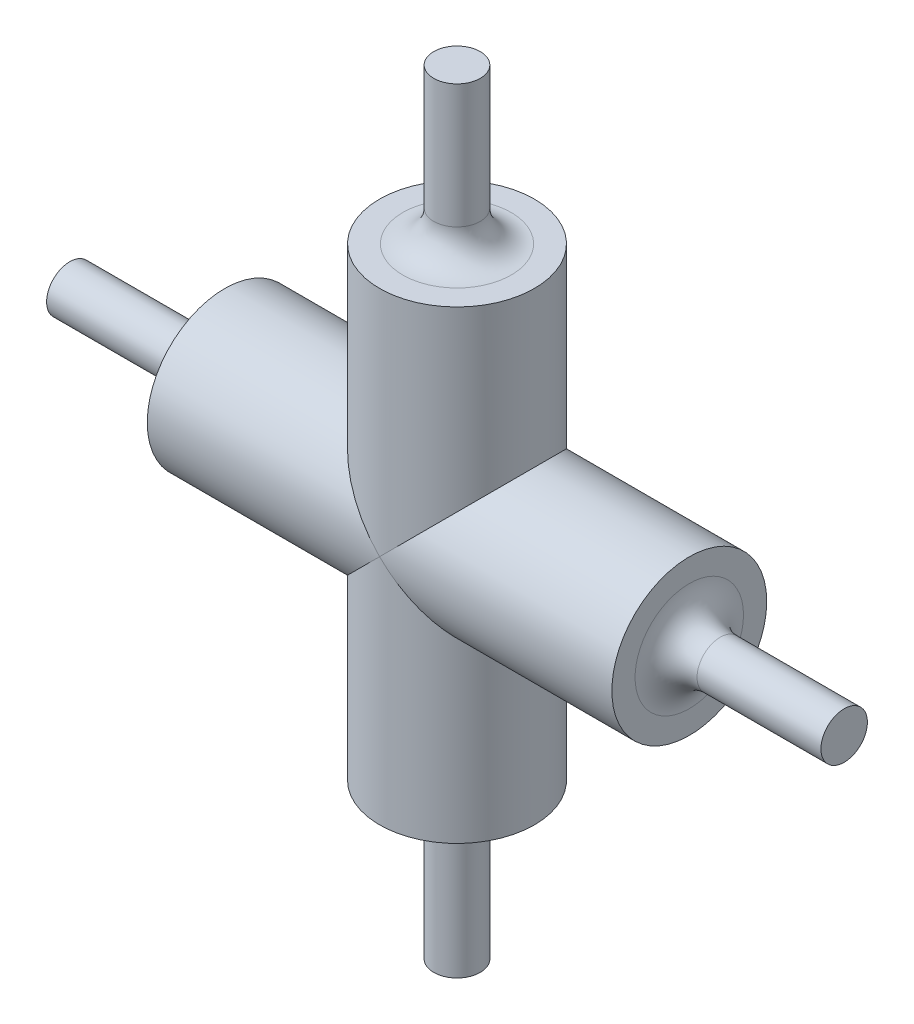
ISO-10303-21;
HEADER;
FILE_DESCRIPTION(('STEP AP214'),'2;1');
FILE_NAME('part.step','',(''),(''),'','','');
FILE_SCHEMA(('AUTOMOTIVE_DESIGN { 1 0 10303 214 1 1 1 1 }'));
ENDSEC;
DATA;
#1=APPLICATION_CONTEXT('core data for automotive mechanical design processes');
#2=APPLICATION_PROTOCOL_DEFINITION('international standard','automotive_design',2000,#1);
#3=PRODUCT_CONTEXT('',#1,'mechanical');
#4=PRODUCT('Part','Part','',(#3));
#5=PRODUCT_RELATED_PRODUCT_CATEGORY('part','',(#4));
#6=PRODUCT_DEFINITION_FORMATION('','',#4);
#7=PRODUCT_DEFINITION_CONTEXT('part definition',#1,'design');
#8=PRODUCT_DEFINITION('design','',#6,#7);
#9=PRODUCT_DEFINITION_SHAPE('','',#8);
#10=(LENGTH_UNIT() NAMED_UNIT(*) SI_UNIT(.MILLI.,.METRE.));
#11=(NAMED_UNIT(*) PLANE_ANGLE_UNIT() SI_UNIT($,.RADIAN.));
#12=(NAMED_UNIT(*) SI_UNIT($,.STERADIAN.) SOLID_ANGLE_UNIT());
#13=UNCERTAINTY_MEASURE_WITH_UNIT(LENGTH_MEASURE(1.E-05),#10,'distance_accuracy_value','');
#14=(GEOMETRIC_REPRESENTATION_CONTEXT(3) GLOBAL_UNCERTAINTY_ASSIGNED_CONTEXT((#13)) GLOBAL_UNIT_ASSIGNED_CONTEXT((#10,
#11,#12)) REPRESENTATION_CONTEXT('',''));
#15=CARTESIAN_POINT('',(0.,0.,0.));
#16=DIRECTION('',(0.,0.,1.));
#17=DIRECTION('',(1.,0.,0.));
#18=AXIS2_PLACEMENT_3D('',#15,#16,#17);
#19=CARTESIAN_POINT('',(0.,50.,0.));
#20=DIRECTION('',(0.,-1.,0.));
#21=DIRECTION('',(0.,0.,-1.));
#22=AXIS2_PLACEMENT_3D('',#19,#20,#21);
#23=CYLINDRICAL_SURFACE('',#22,10.);
#24=CARTESIAN_POINT('',(0.,0.,0.));
#25=DIRECTION('',(-0.707106781186547,-0.707106781186547,0.));
#26=DIRECTION('',(0.707106781186547,-0.707106781186547,0.));
#27=AXIS2_PLACEMENT_3D('',#24,#25,#26);
#28=ELLIPSE('',#27,14.1421356237309,10.);
#29=CARTESIAN_POINT('',(0.,0.,10.));
#30=VERTEX_POINT('',#29);
#31=CARTESIAN_POINT('',(0.,0.,-10.));
#32=VERTEX_POINT('',#31);
#33=EDGE_CURVE('E72',#30,#32,#28,.T.);
#34=ORIENTED_EDGE('',*,*,#33,.F.);
#35=CARTESIAN_POINT('',(0.,0.,0.));
#36=DIRECTION('',(0.707106781186547,-0.707106781186547,0.));
#37=DIRECTION('',(-0.707106781186547,-0.707106781186547,0.));
#38=AXIS2_PLACEMENT_3D('',#35,#36,#37);
#39=ELLIPSE('',#38,14.1421356237309,10.);
#40=EDGE_CURVE('E70',#32,#30,#39,.T.);
#41=ORIENTED_EDGE('',*,*,#40,.F.);
#42=EDGE_LOOP('',(#34,#41));
#43=FACE_BOUND('',#42,.T.);
#44=CARTESIAN_POINT('',(0.,30.,0.));
#45=DIRECTION('',(0.,1.,0.));
#46=DIRECTION('',(-1.,0.,0.));
#47=AXIS2_PLACEMENT_3D('',#44,#45,#46);
#48=CIRCLE('',#47,10.);
#49=CARTESIAN_POINT('',(-10.,30.,0.));
#50=VERTEX_POINT('',#49);
#51=EDGE_CURVE('E115',#50,#50,#48,.T.);
#52=ORIENTED_EDGE('',*,*,#51,.F.);
#53=EDGE_LOOP('',(#52));
#54=FACE_BOUND('',#53,.T.);
#55=ADVANCED_FACE('F49',(#43,#54),#23,.T.);
#56=CARTESIAN_POINT('',(0.,0.,0.));
#57=DIRECTION('',(-0.707106781186547,-0.707106781186547,0.));
#58=DIRECTION('',(0.707106781186547,-0.707106781186547,0.));
#59=AXIS2_PLACEMENT_3D('',#56,#57,#58);
#60=ELLIPSE('',#59,14.1421356237309,10.);
#61=EDGE_CURVE('E80',#30,#32,#60,.F.);
#62=ORIENTED_EDGE('',*,*,#61,.F.);
#63=CARTESIAN_POINT('',(0.,0.,0.));
#64=DIRECTION('',(0.707106781186547,-0.707106781186547,0.));
#65=DIRECTION('',(-0.707106781186547,-0.707106781186547,0.));
#66=AXIS2_PLACEMENT_3D('',#63,#64,#65);
#67=ELLIPSE('',#66,14.1421356237309,10.);
#68=EDGE_CURVE('E64',#32,#30,#67,.F.);
#69=ORIENTED_EDGE('',*,*,#68,.F.);
#70=EDGE_LOOP('',(#62,#69));
#71=FACE_BOUND('',#70,.T.);
#72=CARTESIAN_POINT('',(0.,-30.,0.));
#73=DIRECTION('',(0.,-1.,0.));
#74=DIRECTION('',(1.,0.,0.));
#75=AXIS2_PLACEMENT_3D('',#72,#73,#74);
#76=CIRCLE('',#75,10.);
#77=CARTESIAN_POINT('',(10.,-30.0000000000001,0.));
#78=VERTEX_POINT('',#77);
#79=EDGE_CURVE('E110',#78,#78,#76,.T.);
#80=ORIENTED_EDGE('',*,*,#79,.F.);
#81=EDGE_LOOP('',(#80));
#82=FACE_BOUND('',#81,.T.);
#83=ADVANCED_FACE('F78',(#71,#82),#23,.T.);
#84=CARTESIAN_POINT('',(50.,0.,0.));
#85=DIRECTION('',(-1.,0.,0.));
#86=DIRECTION('',(0.,0.,1.));
#87=AXIS2_PLACEMENT_3D('',#84,#85,#86);
#88=CYLINDRICAL_SURFACE('',#87,10.);
#89=ORIENTED_EDGE('',*,*,#40,.T.);
#90=ORIENTED_EDGE('',*,*,#61,.T.);
#91=EDGE_LOOP('',(#89,#90));
#92=FACE_BOUND('',#91,.T.);
#93=CARTESIAN_POINT('',(30.,0.,0.));
#94=DIRECTION('',(1.,0.,0.));
#95=DIRECTION('',(0.,0.,-1.));
#96=AXIS2_PLACEMENT_3D('',#93,#94,#95);
#97=CIRCLE('',#96,10.);
#98=CARTESIAN_POINT('',(30.,0.,-10.));
#99=VERTEX_POINT('',#98);
#100=EDGE_CURVE('E106',#99,#99,#97,.T.);
#101=ORIENTED_EDGE('',*,*,#100,.F.);
#102=EDGE_LOOP('',(#101));
#103=FACE_BOUND('',#102,.T.);
#104=ADVANCED_FACE('F88',(#92,#103),#88,.T.);
#105=ORIENTED_EDGE('',*,*,#68,.T.);
#106=ORIENTED_EDGE('',*,*,#33,.T.);
#107=EDGE_LOOP('',(#105,#106));
#108=FACE_BOUND('',#107,.T.);
#109=CARTESIAN_POINT('',(-30.,0.,0.));
#110=DIRECTION('',(-1.,0.,0.));
#111=DIRECTION('',(0.,0.,1.));
#112=AXIS2_PLACEMENT_3D('',#109,#110,#111);
#113=CIRCLE('',#112,10.);
#114=CARTESIAN_POINT('',(-30.,0.,10.));
#115=VERTEX_POINT('',#114);
#116=EDGE_CURVE('E82',#115,#115,#113,.T.);
#117=ORIENTED_EDGE('',*,*,#116,.F.);
#118=EDGE_LOOP('',(#117));
#119=FACE_BOUND('',#118,.T.);
#120=ADVANCED_FACE('F84',(#108,#119),#88,.T.);
#121=CARTESIAN_POINT('',(-30.,0.,0.));
#122=DIRECTION('',(-1.,0.,0.));
#123=DIRECTION('',(0.,0.,1.));
#124=AXIS2_PLACEMENT_3D('',#121,#122,#123);
#125=PLANE('',#124);
#126=CARTESIAN_POINT('',(-30.,0.,0.));
#127=DIRECTION('',(-1.,0.,0.));
#128=DIRECTION('',(0.,0.,1.));
#129=AXIS2_PLACEMENT_3D('',#126,#127,#128);
#130=CIRCLE('',#129,7.);
#131=CARTESIAN_POINT('',(-30.,0.,7.));
#132=VERTEX_POINT('',#131);
#133=EDGE_CURVE('E95',#132,#132,#130,.F.);
#134=ORIENTED_EDGE('',*,*,#133,.T.);
#135=EDGE_LOOP('',(#134));
#136=FACE_BOUND('',#135,.T.);
#137=ORIENTED_EDGE('',*,*,#116,.T.);
#138=EDGE_LOOP('',(#137));
#139=FACE_BOUND('',#138,.T.);
#140=ADVANCED_FACE('F199',(#136,#139),#125,.T.);
#141=CARTESIAN_POINT('',(-30.,0.,0.));
#142=DIRECTION('',(-1.,0.,0.));
#143=DIRECTION('',(0.,0.,1.));
#144=AXIS2_PLACEMENT_3D('',#141,#142,#143);
#145=CYLINDRICAL_SURFACE('',#144,3.);
#146=CARTESIAN_POINT('',(-34.,0.,0.));
#147=DIRECTION('',(-1.,0.,0.));
#148=DIRECTION('',(0.,0.,1.));
#149=AXIS2_PLACEMENT_3D('',#146,#147,#148);
#150=CIRCLE('',#149,3.);
#151=CARTESIAN_POINT('',(-34.,0.,3.));
#152=VERTEX_POINT('',#151);
#153=EDGE_CURVE('E91',#152,#152,#150,.T.);
#154=ORIENTED_EDGE('',*,*,#153,.T.);
#155=EDGE_LOOP('',(#154));
#156=FACE_BOUND('',#155,.T.);
#157=CARTESIAN_POINT('',(-50.,0.,0.));
#158=DIRECTION('',(-1.,0.,0.));
#159=DIRECTION('',(0.,0.,1.));
#160=AXIS2_PLACEMENT_3D('',#157,#158,#159);
#161=CIRCLE('',#160,3.);
#162=CARTESIAN_POINT('',(-50.,0.,3.));
#163=VERTEX_POINT('',#162);
#164=EDGE_CURVE('E100',#163,#163,#161,.T.);
#165=ORIENTED_EDGE('',*,*,#164,.F.);
#166=EDGE_LOOP('',(#165));
#167=FACE_BOUND('',#166,.T.);
#168=ADVANCED_FACE('F197',(#156,#167),#145,.T.);
#169=CARTESIAN_POINT('',(-50.,0.,0.));
#170=DIRECTION('',(1.,0.,0.));
#171=DIRECTION('',(0.,0.,-1.));
#172=AXIS2_PLACEMENT_3D('',#169,#170,#171);
#173=PLANE('',#172);
#174=ORIENTED_EDGE('',*,*,#164,.T.);
#175=EDGE_LOOP('',(#174));
#176=FACE_BOUND('',#175,.T.);
#177=ADVANCED_FACE('F162',(#176),#173,.F.);
#178=CARTESIAN_POINT('',(-34.,0.,0.));
#179=DIRECTION('',(-1.,0.,0.));
#180=DIRECTION('',(0.,0.,1.));
#181=AXIS2_PLACEMENT_3D('',#178,#179,#180);
#182=TOROIDAL_SURFACE('',#181,7.,4.);
#183=ORIENTED_EDGE('',*,*,#133,.F.);
#184=EDGE_LOOP('',(#183));
#185=FACE_BOUND('',#184,.T.);
#186=ORIENTED_EDGE('',*,*,#153,.F.);
#187=EDGE_LOOP('',(#186));
#188=FACE_BOUND('',#187,.T.);
#189=ADVANCED_FACE('F159',(#185,#188),#182,.F.);
#190=CARTESIAN_POINT('',(30.,0.,0.));
#191=DIRECTION('',(1.,0.,0.));
#192=DIRECTION('',(0.,0.,-1.));
#193=AXIS2_PLACEMENT_3D('',#190,#191,#192);
#194=CYLINDRICAL_SURFACE('',#193,3.);
#195=CARTESIAN_POINT('',(34.,0.,0.));
#196=DIRECTION('',(1.,0.,0.));
#197=DIRECTION('',(0.,0.,-1.));
#198=AXIS2_PLACEMENT_3D('',#195,#196,#197);
#199=CIRCLE('',#198,3.);
#200=CARTESIAN_POINT('',(34.,0.,-3.));
#201=VERTEX_POINT('',#200);
#202=EDGE_CURVE('E126',#201,#201,#199,.T.);
#203=ORIENTED_EDGE('',*,*,#202,.T.);
#204=EDGE_LOOP('',(#203));
#205=FACE_BOUND('',#204,.T.);
#206=CARTESIAN_POINT('',(50.,0.,0.));
#207=DIRECTION('',(1.,0.,0.));
#208=DIRECTION('',(0.,0.,1.));
#209=AXIS2_PLACEMENT_3D('',#206,#207,#208);
#210=CIRCLE('',#209,3.);
#211=CARTESIAN_POINT('',(50.,0.,3.));
#212=VERTEX_POINT('',#211);
#213=EDGE_CURVE('E184',#212,#212,#210,.T.);
#214=ORIENTED_EDGE('',*,*,#213,.F.);
#215=EDGE_LOOP('',(#214));
#216=FACE_BOUND('',#215,.T.);
#217=ADVANCED_FACE('F161',(#205,#216),#194,.T.);
#218=CARTESIAN_POINT('',(30.,0.,0.));
#219=DIRECTION('',(1.,0.,0.));
#220=DIRECTION('',(0.,0.,-1.));
#221=AXIS2_PLACEMENT_3D('',#218,#219,#220);
#222=PLANE('',#221);
#223=CARTESIAN_POINT('',(30.,0.,0.));
#224=DIRECTION('',(1.,0.,0.));
#225=DIRECTION('',(0.,0.,-1.));
#226=AXIS2_PLACEMENT_3D('',#223,#224,#225);
#227=CIRCLE('',#226,7.);
#228=CARTESIAN_POINT('',(30.,0.,-7.));
#229=VERTEX_POINT('',#228);
#230=EDGE_CURVE('E130',#229,#229,#227,.F.);
#231=ORIENTED_EDGE('',*,*,#230,.T.);
#232=EDGE_LOOP('',(#231));
#233=FACE_BOUND('',#232,.T.);
#234=ORIENTED_EDGE('',*,*,#100,.T.);
#235=EDGE_LOOP('',(#234));
#236=FACE_BOUND('',#235,.T.);
#237=ADVANCED_FACE('F281',(#233,#236),#222,.T.);
#238=CARTESIAN_POINT('',(-3.14233320495882E-13,-30.,0.));
#239=DIRECTION('',(0.,-1.,0.));
#240=DIRECTION('',(1.,0.,0.));
#241=AXIS2_PLACEMENT_3D('',#238,#239,#240);
#242=PLANE('',#241);
#243=CARTESIAN_POINT('',(-3.14233320495882E-13,-30.,0.));
#244=DIRECTION('',(0.,-1.,0.));
#245=DIRECTION('',(1.,0.,0.));
#246=AXIS2_PLACEMENT_3D('',#243,#244,#245);
#247=CIRCLE('',#246,7.);
#248=CARTESIAN_POINT('',(6.99999999999969,-30.0000000000001,0.));
#249=VERTEX_POINT('',#248);
#250=EDGE_CURVE('E12',#249,#249,#247,.F.);
#251=ORIENTED_EDGE('',*,*,#250,.T.);
#252=EDGE_LOOP('',(#251));
#253=FACE_BOUND('',#252,.T.);
#254=ORIENTED_EDGE('',*,*,#79,.T.);
#255=EDGE_LOOP('',(#254));
#256=FACE_BOUND('',#255,.T.);
#257=ADVANCED_FACE('F291',(#253,#256),#242,.T.);
#258=CARTESIAN_POINT('',(-3.14233320495882E-13,-30.,0.));
#259=DIRECTION('',(0.,-1.,0.));
#260=DIRECTION('',(1.,0.,0.));
#261=AXIS2_PLACEMENT_3D('',#258,#259,#260);
#262=CYLINDRICAL_SURFACE('',#261,3.);
#263=CARTESIAN_POINT('',(-3.56131096561999E-13,-34.,0.));
#264=DIRECTION('',(0.,-1.,0.));
#265=DIRECTION('',(1.,0.,0.));
#266=AXIS2_PLACEMENT_3D('',#263,#264,#265);
#267=CIRCLE('',#266,3.);
#268=CARTESIAN_POINT('',(2.99999999999964,-34.,0.));
#269=VERTEX_POINT('',#268);
#270=EDGE_CURVE('E58',#269,#269,#267,.T.);
#271=ORIENTED_EDGE('',*,*,#270,.T.);
#272=EDGE_LOOP('',(#271));
#273=FACE_BOUND('',#272,.T.);
#274=CARTESIAN_POINT('',(-5.2372220082647E-13,-50.,0.));
#275=DIRECTION('',(0.,-1.,0.));
#276=DIRECTION('',(0.,0.,1.));
#277=AXIS2_PLACEMENT_3D('',#274,#275,#276);
#278=CIRCLE('',#277,3.);
#279=CARTESIAN_POINT('',(-5.2372220082647E-13,-50.,3.));
#280=VERTEX_POINT('',#279);
#281=EDGE_CURVE('E188',#280,#280,#278,.T.);
#282=ORIENTED_EDGE('',*,*,#281,.F.);
#283=EDGE_LOOP('',(#282));
#284=FACE_BOUND('',#283,.T.);
#285=ADVANCED_FACE('F137',(#273,#284),#262,.T.);
#286=CARTESIAN_POINT('',(0.,-50.,0.));
#287=DIRECTION('',(0.,1.,0.));
#288=DIRECTION('',(0.,0.,1.));
#289=AXIS2_PLACEMENT_3D('',#286,#287,#288);
#290=PLANE('',#289);
#291=ORIENTED_EDGE('',*,*,#281,.T.);
#292=EDGE_LOOP('',(#291));
#293=FACE_BOUND('',#292,.T.);
#294=ADVANCED_FACE('F157',(#293),#290,.F.);
#295=CARTESIAN_POINT('',(1.04744440165294E-13,30.,0.));
#296=DIRECTION('',(0.,1.,0.));
#297=DIRECTION('',(-1.,0.,0.));
#298=AXIS2_PLACEMENT_3D('',#295,#296,#297);
#299=PLANE('',#298);
#300=CARTESIAN_POINT('',(1.04744440165294E-13,30.,0.));
#301=DIRECTION('',(0.,1.,0.));
#302=DIRECTION('',(-1.,0.,0.));
#303=AXIS2_PLACEMENT_3D('',#300,#301,#302);
#304=CIRCLE('',#303,7.);
#305=CARTESIAN_POINT('',(-6.9999999999999,30.,0.));
#306=VERTEX_POINT('',#305);
#307=EDGE_CURVE('E122',#306,#306,#304,.F.);
#308=ORIENTED_EDGE('',*,*,#307,.T.);
#309=EDGE_LOOP('',(#308));
#310=FACE_BOUND('',#309,.T.);
#311=ORIENTED_EDGE('',*,*,#51,.T.);
#312=EDGE_LOOP('',(#311));
#313=FACE_BOUND('',#312,.T.);
#314=ADVANCED_FACE('F179',(#310,#313),#299,.T.);
#315=CARTESIAN_POINT('',(1.04744440165294E-13,30.,0.));
#316=DIRECTION('',(0.,1.,0.));
#317=DIRECTION('',(-1.,0.,0.));
#318=AXIS2_PLACEMENT_3D('',#315,#316,#317);
#319=CYLINDRICAL_SURFACE('',#318,3.);
#320=CARTESIAN_POINT('',(1.18710365520667E-13,34.,0.));
#321=DIRECTION('',(0.,1.,0.));
#322=DIRECTION('',(-1.,0.,0.));
#323=AXIS2_PLACEMENT_3D('',#320,#321,#322);
#324=CIRCLE('',#323,3.);
#325=CARTESIAN_POINT('',(-2.99999999999988,34.,0.));
#326=VERTEX_POINT('',#325);
#327=EDGE_CURVE('E105',#326,#326,#324,.T.);
#328=ORIENTED_EDGE('',*,*,#327,.T.);
#329=EDGE_LOOP('',(#328));
#330=FACE_BOUND('',#329,.T.);
#331=CARTESIAN_POINT('',(1.74574066942157E-13,50.,0.));
#332=DIRECTION('',(0.,1.,0.));
#333=DIRECTION('',(0.,0.,1.));
#334=AXIS2_PLACEMENT_3D('',#331,#332,#333);
#335=CIRCLE('',#334,3.);
#336=CARTESIAN_POINT('',(1.74574066942157E-13,50.,3.));
#337=VERTEX_POINT('',#336);
#338=EDGE_CURVE('E111',#337,#337,#335,.T.);
#339=ORIENTED_EDGE('',*,*,#338,.F.);
#340=EDGE_LOOP('',(#339));
#341=FACE_BOUND('',#340,.T.);
#342=ADVANCED_FACE('F176',(#330,#341),#319,.T.);
#343=CARTESIAN_POINT('',(50.,0.,0.));
#344=DIRECTION('',(1.,0.,0.));
#345=DIRECTION('',(0.,0.,-1.));
#346=AXIS2_PLACEMENT_3D('',#343,#344,#345);
#347=PLANE('',#346);
#348=ORIENTED_EDGE('',*,*,#213,.T.);
#349=EDGE_LOOP('',(#348));
#350=FACE_BOUND('',#349,.T.);
#351=ADVANCED_FACE('F170',(#350),#347,.T.);
#352=CARTESIAN_POINT('',(0.,50.,0.));
#353=DIRECTION('',(0.,1.,0.));
#354=DIRECTION('',(0.,0.,1.));
#355=AXIS2_PLACEMENT_3D('',#352,#353,#354);
#356=PLANE('',#355);
#357=ORIENTED_EDGE('',*,*,#338,.T.);
#358=EDGE_LOOP('',(#357));
#359=FACE_BOUND('',#358,.T.);
#360=ADVANCED_FACE('F165',(#359),#356,.T.);
#361=CARTESIAN_POINT('',(1.18710365520667E-13,34.,0.));
#362=DIRECTION('',(0.,1.,0.));
#363=DIRECTION('',(-1.,0.,0.));
#364=AXIS2_PLACEMENT_3D('',#361,#362,#363);
#365=TOROIDAL_SURFACE('',#364,7.,4.);
#366=ORIENTED_EDGE('',*,*,#307,.F.);
#367=EDGE_LOOP('',(#366));
#368=FACE_BOUND('',#367,.T.);
#369=ORIENTED_EDGE('',*,*,#327,.F.);
#370=EDGE_LOOP('',(#369));
#371=FACE_BOUND('',#370,.T.);
#372=ADVANCED_FACE('F146',(#368,#371),#365,.F.);
#373=CARTESIAN_POINT('',(34.,0.,0.));
#374=DIRECTION('',(1.,0.,0.));
#375=DIRECTION('',(0.,0.,-1.));
#376=AXIS2_PLACEMENT_3D('',#373,#374,#375);
#377=TOROIDAL_SURFACE('',#376,7.,4.);
#378=ORIENTED_EDGE('',*,*,#230,.F.);
#379=EDGE_LOOP('',(#378));
#380=FACE_BOUND('',#379,.T.);
#381=ORIENTED_EDGE('',*,*,#202,.F.);
#382=EDGE_LOOP('',(#381));
#383=FACE_BOUND('',#382,.T.);
#384=ADVANCED_FACE('F141',(#380,#383),#377,.F.);
#385=CARTESIAN_POINT('',(-3.56131096561999E-13,-34.,0.));
#386=DIRECTION('',(0.,-1.,0.));
#387=DIRECTION('',(1.,0.,0.));
#388=AXIS2_PLACEMENT_3D('',#385,#386,#387);
#389=TOROIDAL_SURFACE('',#388,7.,4.);
#390=ORIENTED_EDGE('',*,*,#250,.F.);
#391=EDGE_LOOP('',(#390));
#392=FACE_BOUND('',#391,.T.);
#393=ORIENTED_EDGE('',*,*,#270,.F.);
#394=EDGE_LOOP('',(#393));
#395=FACE_BOUND('',#394,.T.);
#396=ADVANCED_FACE('F51',(#392,#395),#389,.F.);
#397=CLOSED_SHELL('',(#55,#83,#104,#120,#140,#168,#177,#189,#217,#237,#257,#285,#294,#314,#342,
#351,#360,#372,#384,#396));
#398=MANIFOLD_SOLID_BREP('B2',#397);
#399=ADVANCED_BREP_SHAPE_REPRESENTATION('',(#18,#398),#14);
#400=SHAPE_DEFINITION_REPRESENTATION(#9,#399);
ENDSEC;
END-ISO-10303-21;
